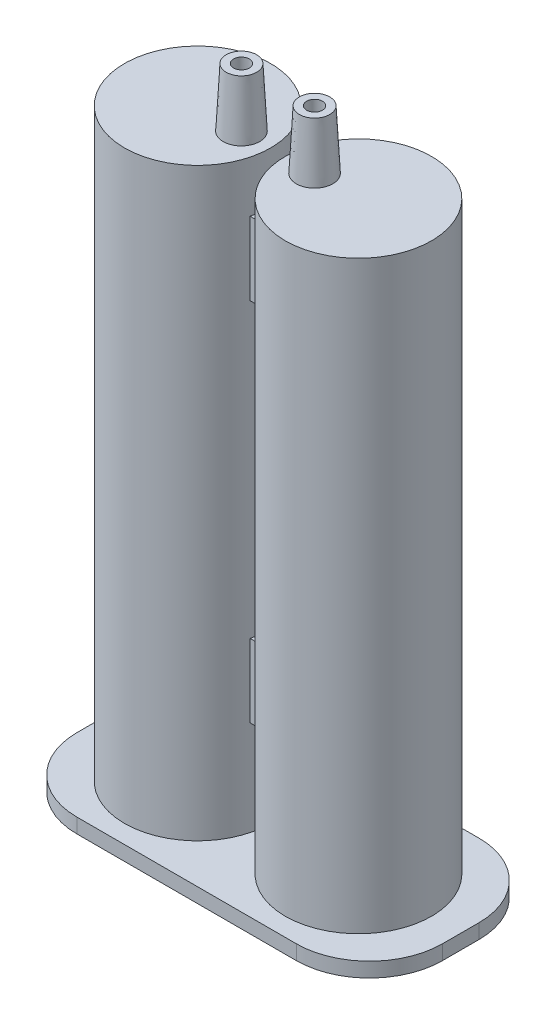
ISO-10303-21;
HEADER;
FILE_DESCRIPTION(('STEP AP214'),'2;1');
FILE_NAME('part.step','',(''),(''),'','','');
FILE_SCHEMA(('AUTOMOTIVE_DESIGN { 1 0 10303 214 1 1 1 1 }'));
ENDSEC;
DATA;
#1=APPLICATION_CONTEXT('core data for automotive mechanical design processes');
#2=APPLICATION_PROTOCOL_DEFINITION('international standard','automotive_design',2000,#1);
#3=PRODUCT_CONTEXT('',#1,'mechanical');
#4=PRODUCT('Part','Part','',(#3));
#5=PRODUCT_RELATED_PRODUCT_CATEGORY('part','',(#4));
#6=PRODUCT_DEFINITION_FORMATION('','',#4);
#7=PRODUCT_DEFINITION_CONTEXT('part definition',#1,'design');
#8=PRODUCT_DEFINITION('design','',#6,#7);
#9=PRODUCT_DEFINITION_SHAPE('','',#8);
#10=(LENGTH_UNIT() NAMED_UNIT(*) SI_UNIT(.MILLI.,.METRE.));
#11=(NAMED_UNIT(*) PLANE_ANGLE_UNIT() SI_UNIT($,.RADIAN.));
#12=(NAMED_UNIT(*) SI_UNIT($,.STERADIAN.) SOLID_ANGLE_UNIT());
#13=UNCERTAINTY_MEASURE_WITH_UNIT(LENGTH_MEASURE(1.E-05),#10,'distance_accuracy_value','');
#14=(GEOMETRIC_REPRESENTATION_CONTEXT(3) GLOBAL_UNCERTAINTY_ASSIGNED_CONTEXT((#13)) GLOBAL_UNIT_ASSIGNED_CONTEXT((#10,
#11,#12)) REPRESENTATION_CONTEXT('',''));
#15=CARTESIAN_POINT('',(0.,0.,0.));
#16=DIRECTION('',(0.,0.,1.));
#17=DIRECTION('',(1.,0.,0.));
#18=AXIS2_PLACEMENT_3D('',#15,#16,#17);
#19=CARTESIAN_POINT('',(-11.,82.,0.));
#20=DIRECTION('',(0.,-1.,0.));
#21=DIRECTION('',(0.,0.,-1.));
#22=AXIS2_PLACEMENT_3D('',#19,#20,#21);
#23=CYLINDRICAL_SURFACE('',#22,10.);
#24=CARTESIAN_POINT('',(-11.,25.,0.));
#25=DIRECTION('',(0.,1.,0.));
#26=DIRECTION('',(0.,0.,1.));
#27=AXIS2_PLACEMENT_3D('',#24,#25,#26);
#28=CIRCLE('',#27,10.);
#29=CARTESIAN_POINT('',(-1.31754163448146,25.,-2.5));
#30=VERTEX_POINT('',#29);
#31=CARTESIAN_POINT('',(-1.31754163448146,25.,2.5));
#32=VERTEX_POINT('',#31);
#33=EDGE_CURVE('E215',#30,#32,#28,.F.);
#34=ORIENTED_EDGE('',*,*,#33,.F.);
#35=DIRECTION('',(0.,-1.,0.));
#36=VECTOR('',#35,1.);
#37=CARTESIAN_POINT('',(-1.31754163448146,25.,-2.5));
#38=LINE('',#37,#36);
#39=CARTESIAN_POINT('',(-1.31754163448146,15.,-2.5));
#40=VERTEX_POINT('',#39);
#41=EDGE_CURVE('E238',#30,#40,#38,.T.);
#42=ORIENTED_EDGE('',*,*,#41,.T.);
#43=CARTESIAN_POINT('',(-11.,15.,0.));
#44=DIRECTION('',(0.,1.,0.));
#45=DIRECTION('',(0.,0.,1.));
#46=AXIS2_PLACEMENT_3D('',#43,#44,#45);
#47=CIRCLE('',#46,10.);
#48=CARTESIAN_POINT('',(-1.31754163448146,15.,2.5));
#49=VERTEX_POINT('',#48);
#50=EDGE_CURVE('E229',#40,#49,#47,.F.);
#51=ORIENTED_EDGE('',*,*,#50,.T.);
#52=DIRECTION('',(0.,-1.,0.));
#53=VECTOR('',#52,1.);
#54=CARTESIAN_POINT('',(-1.31754163448146,25.,2.5));
#55=LINE('',#54,#53);
#56=EDGE_CURVE('E237',#32,#49,#55,.T.);
#57=ORIENTED_EDGE('',*,*,#56,.F.);
#58=EDGE_LOOP('',(#34,#42,#51,#57));
#59=FACE_BOUND('',#58,.T.);
#60=CARTESIAN_POINT('',(-11.,82.,0.));
#61=DIRECTION('',(0.,1.,0.));
#62=DIRECTION('',(0.,0.,1.));
#63=AXIS2_PLACEMENT_3D('',#60,#61,#62);
#64=CIRCLE('',#63,10.);
#65=CARTESIAN_POINT('',(-11.,82.,10.));
#66=VERTEX_POINT('',#65);
#67=EDGE_CURVE('E295',#66,#66,#64,.T.);
#68=ORIENTED_EDGE('',*,*,#67,.F.);
#69=EDGE_LOOP('',(#68));
#70=FACE_BOUND('',#69,.T.);
#71=CARTESIAN_POINT('',(-11.,2.,0.));
#72=DIRECTION('',(0.,1.,0.));
#73=DIRECTION('',(0.,0.,1.));
#74=AXIS2_PLACEMENT_3D('',#71,#72,#73);
#75=CIRCLE('',#74,10.);
#76=CARTESIAN_POINT('',(-11.,2.,10.));
#77=VERTEX_POINT('',#76);
#78=EDGE_CURVE('E284',#77,#77,#75,.T.);
#79=ORIENTED_EDGE('',*,*,#78,.T.);
#80=EDGE_LOOP('',(#79));
#81=FACE_BOUND('',#80,.T.);
#82=CARTESIAN_POINT('',(-11.,75.,0.));
#83=DIRECTION('',(0.,1.,0.));
#84=DIRECTION('',(0.,0.,1.));
#85=AXIS2_PLACEMENT_3D('',#82,#83,#84);
#86=CIRCLE('',#85,10.);
#87=CARTESIAN_POINT('',(-1.31754163448146,75.,-2.5));
#88=VERTEX_POINT('',#87);
#89=CARTESIAN_POINT('',(-1.31754163448146,75.,2.5));
#90=VERTEX_POINT('',#89);
#91=EDGE_CURVE('E75',#88,#90,#86,.F.);
#92=ORIENTED_EDGE('',*,*,#91,.F.);
#93=DIRECTION('',(0.,-1.,0.));
#94=VECTOR('',#93,1.);
#95=CARTESIAN_POINT('',(-1.31754163448146,75.,-2.5));
#96=LINE('',#95,#94);
#97=CARTESIAN_POINT('',(-1.31754163448146,65.,-2.5));
#98=VERTEX_POINT('',#97);
#99=EDGE_CURVE('E195',#88,#98,#96,.T.);
#100=ORIENTED_EDGE('',*,*,#99,.T.);
#101=CARTESIAN_POINT('',(-11.,65.,0.));
#102=DIRECTION('',(0.,1.,0.));
#103=DIRECTION('',(0.,0.,1.));
#104=AXIS2_PLACEMENT_3D('',#101,#102,#103);
#105=CIRCLE('',#104,10.);
#106=CARTESIAN_POINT('',(-1.31754163448146,65.,2.5));
#107=VERTEX_POINT('',#106);
#108=EDGE_CURVE('E181',#98,#107,#105,.F.);
#109=ORIENTED_EDGE('',*,*,#108,.T.);
#110=DIRECTION('',(0.,-1.,0.));
#111=VECTOR('',#110,1.);
#112=CARTESIAN_POINT('',(-1.31754163448146,75.,2.5));
#113=LINE('',#112,#111);
#114=EDGE_CURVE('E67',#90,#107,#113,.T.);
#115=ORIENTED_EDGE('',*,*,#114,.F.);
#116=EDGE_LOOP('',(#92,#100,#109,#115));
#117=FACE_BOUND('',#116,.T.);
#118=ADVANCED_FACE('F47',(#59,#70,#81,#117),#23,.T.);
#119=CARTESIAN_POINT('',(15.,2.,-2.5));
#120=DIRECTION('',(0.,-1.,0.));
#121=DIRECTION('',(0.,0.,-1.));
#122=AXIS2_PLACEMENT_3D('',#119,#120,#121);
#123=CYLINDRICAL_SURFACE('',#122,10.);
#124=CARTESIAN_POINT('',(15.,0.,-2.5));
#125=DIRECTION('',(0.,1.,0.));
#126=DIRECTION('',(0.,0.,-1.));
#127=AXIS2_PLACEMENT_3D('',#124,#125,#126);
#128=CIRCLE('',#127,10.);
#129=CARTESIAN_POINT('',(25.,0.,-2.49999999999993));
#130=VERTEX_POINT('',#129);
#131=CARTESIAN_POINT('',(14.9999999999999,0.,-12.5));
#132=VERTEX_POINT('',#131);
#133=EDGE_CURVE('E296',#130,#132,#128,.T.);
#134=ORIENTED_EDGE('',*,*,#133,.T.);
#135=DIRECTION('',(0.,-1.,0.));
#136=VECTOR('',#135,1.);
#137=CARTESIAN_POINT('',(14.9999999999999,2.,-12.5));
#138=LINE('',#137,#136);
#139=CARTESIAN_POINT('',(14.9999999999999,2.,-12.5));
#140=VERTEX_POINT('',#139);
#141=EDGE_CURVE('E52',#140,#132,#138,.T.);
#142=ORIENTED_EDGE('',*,*,#141,.F.);
#143=CARTESIAN_POINT('',(15.,2.,-2.5));
#144=DIRECTION('',(0.,1.,0.));
#145=DIRECTION('',(0.,0.,-1.));
#146=AXIS2_PLACEMENT_3D('',#143,#144,#145);
#147=CIRCLE('',#146,10.);
#148=CARTESIAN_POINT('',(25.,2.,-2.49999999999993));
#149=VERTEX_POINT('',#148);
#150=EDGE_CURVE('E307',#149,#140,#147,.T.);
#151=ORIENTED_EDGE('',*,*,#150,.F.);
#152=DIRECTION('',(0.,-1.,0.));
#153=VECTOR('',#152,1.);
#154=CARTESIAN_POINT('',(25.,2.,-2.49999999999993));
#155=LINE('',#154,#153);
#156=EDGE_CURVE('E334',#149,#130,#155,.T.);
#157=ORIENTED_EDGE('',*,*,#156,.T.);
#158=EDGE_LOOP('',(#134,#142,#151,#157));
#159=FACE_BOUND('',#158,.T.);
#160=ADVANCED_FACE('F51',(#159),#123,.T.);
#161=CARTESIAN_POINT('',(-14.9999999999999,2.,-12.5));
#162=DIRECTION('',(0.,0.,1.));
#163=DIRECTION('',(1.,0.,0.));
#164=AXIS2_PLACEMENT_3D('',#161,#162,#163);
#165=PLANE('',#164);
#166=DIRECTION('',(-1.,0.,0.));
#167=VECTOR('',#166,1.);
#168=CARTESIAN_POINT('',(-14.9999999999999,0.,-12.5));
#169=LINE('',#168,#167);
#170=CARTESIAN_POINT('',(-14.9999999999999,0.,-12.5));
#171=VERTEX_POINT('',#170);
#172=EDGE_CURVE('E337',#132,#171,#169,.T.);
#173=ORIENTED_EDGE('',*,*,#172,.T.);
#174=DIRECTION('',(0.,-1.,0.));
#175=VECTOR('',#174,1.);
#176=CARTESIAN_POINT('',(-14.9999999999999,2.,-12.5));
#177=LINE('',#176,#175);
#178=CARTESIAN_POINT('',(-14.9999999999999,2.,-12.5));
#179=VERTEX_POINT('',#178);
#180=EDGE_CURVE('E377',#179,#171,#177,.T.);
#181=ORIENTED_EDGE('',*,*,#180,.F.);
#182=DIRECTION('',(-1.,0.,0.));
#183=VECTOR('',#182,1.);
#184=CARTESIAN_POINT('',(-14.9999999999999,2.,-12.5));
#185=LINE('',#184,#183);
#186=EDGE_CURVE('E313',#140,#179,#185,.T.);
#187=ORIENTED_EDGE('',*,*,#186,.F.);
#188=ORIENTED_EDGE('',*,*,#141,.T.);
#189=EDGE_LOOP('',(#173,#181,#187,#188));
#190=FACE_BOUND('',#189,.T.);
#191=ADVANCED_FACE('F388',(#190),#165,.F.);
#192=CARTESIAN_POINT('',(-15.,2.,-2.5));
#193=DIRECTION('',(0.,-1.,0.));
#194=DIRECTION('',(0.,0.,-1.));
#195=AXIS2_PLACEMENT_3D('',#192,#193,#194);
#196=CYLINDRICAL_SURFACE('',#195,10.);
#197=CARTESIAN_POINT('',(-15.,0.,-2.5));
#198=DIRECTION('',(0.,1.,0.));
#199=DIRECTION('',(0.,0.,-1.));
#200=AXIS2_PLACEMENT_3D('',#197,#198,#199);
#201=CIRCLE('',#200,10.);
#202=CARTESIAN_POINT('',(-25.,0.,-2.49999999999993));
#203=VERTEX_POINT('',#202);
#204=EDGE_CURVE('E340',#171,#203,#201,.T.);
#205=ORIENTED_EDGE('',*,*,#204,.T.);
#206=DIRECTION('',(0.,-1.,0.));
#207=VECTOR('',#206,1.);
#208=CARTESIAN_POINT('',(-25.,2.,-2.49999999999993));
#209=LINE('',#208,#207);
#210=CARTESIAN_POINT('',(-25.,2.,-2.49999999999993));
#211=VERTEX_POINT('',#210);
#212=EDGE_CURVE('E376',#211,#203,#209,.T.);
#213=ORIENTED_EDGE('',*,*,#212,.F.);
#214=CARTESIAN_POINT('',(-15.,2.,-2.5));
#215=DIRECTION('',(0.,1.,0.));
#216=DIRECTION('',(0.,0.,-1.));
#217=AXIS2_PLACEMENT_3D('',#214,#215,#216);
#218=CIRCLE('',#217,10.);
#219=EDGE_CURVE('E312',#179,#211,#218,.T.);
#220=ORIENTED_EDGE('',*,*,#219,.F.);
#221=ORIENTED_EDGE('',*,*,#180,.T.);
#222=EDGE_LOOP('',(#205,#213,#220,#221));
#223=FACE_BOUND('',#222,.T.);
#224=ADVANCED_FACE('F405',(#223),#196,.T.);
#225=CARTESIAN_POINT('',(-25.,2.,2.49999999999993));
#226=DIRECTION('',(1.,0.,0.));
#227=DIRECTION('',(0.,0.,-1.));
#228=AXIS2_PLACEMENT_3D('',#225,#226,#227);
#229=PLANE('',#228);
#230=DIRECTION('',(0.,0.,1.));
#231=VECTOR('',#230,1.);
#232=CARTESIAN_POINT('',(-25.,0.,2.49999999999993));
#233=LINE('',#232,#231);
#234=CARTESIAN_POINT('',(-25.,0.,2.49999999999993));
#235=VERTEX_POINT('',#234);
#236=EDGE_CURVE('E344',#203,#235,#233,.T.);
#237=ORIENTED_EDGE('',*,*,#236,.T.);
#238=DIRECTION('',(0.,-1.,0.));
#239=VECTOR('',#238,1.);
#240=CARTESIAN_POINT('',(-25.,2.,2.49999999999993));
#241=LINE('',#240,#239);
#242=CARTESIAN_POINT('',(-25.,2.,2.49999999999993));
#243=VERTEX_POINT('',#242);
#244=EDGE_CURVE('E375',#243,#235,#241,.T.);
#245=ORIENTED_EDGE('',*,*,#244,.F.);
#246=DIRECTION('',(0.,0.,1.));
#247=VECTOR('',#246,1.);
#248=CARTESIAN_POINT('',(-25.,2.,2.49999999999993));
#249=LINE('',#248,#247);
#250=EDGE_CURVE('E318',#211,#243,#249,.T.);
#251=ORIENTED_EDGE('',*,*,#250,.F.);
#252=ORIENTED_EDGE('',*,*,#212,.T.);
#253=EDGE_LOOP('',(#237,#245,#251,#252));
#254=FACE_BOUND('',#253,.T.);
#255=ADVANCED_FACE('F403',(#254),#229,.F.);
#256=CARTESIAN_POINT('',(-15.,2.,2.5));
#257=DIRECTION('',(0.,-1.,0.));
#258=DIRECTION('',(0.,0.,-1.));
#259=AXIS2_PLACEMENT_3D('',#256,#257,#258);
#260=CYLINDRICAL_SURFACE('',#259,10.);
#261=CARTESIAN_POINT('',(-15.,0.,2.5));
#262=DIRECTION('',(0.,1.,0.));
#263=DIRECTION('',(0.,0.,-1.));
#264=AXIS2_PLACEMENT_3D('',#261,#262,#263);
#265=CIRCLE('',#264,10.);
#266=CARTESIAN_POINT('',(-14.9999999999999,0.,12.5));
#267=VERTEX_POINT('',#266);
#268=EDGE_CURVE('E347',#235,#267,#265,.T.);
#269=ORIENTED_EDGE('',*,*,#268,.T.);
#270=DIRECTION('',(0.,-1.,0.));
#271=VECTOR('',#270,1.);
#272=CARTESIAN_POINT('',(-14.9999999999999,2.,12.5));
#273=LINE('',#272,#271);
#274=CARTESIAN_POINT('',(-14.9999999999999,2.,12.5));
#275=VERTEX_POINT('',#274);
#276=EDGE_CURVE('E366',#275,#267,#273,.T.);
#277=ORIENTED_EDGE('',*,*,#276,.F.);
#278=CARTESIAN_POINT('',(-15.,2.,2.5));
#279=DIRECTION('',(0.,1.,0.));
#280=DIRECTION('',(0.,0.,-1.));
#281=AXIS2_PLACEMENT_3D('',#278,#279,#280);
#282=CIRCLE('',#281,10.);
#283=EDGE_CURVE('E321',#243,#275,#282,.T.);
#284=ORIENTED_EDGE('',*,*,#283,.F.);
#285=ORIENTED_EDGE('',*,*,#244,.T.);
#286=EDGE_LOOP('',(#269,#277,#284,#285));
#287=FACE_BOUND('',#286,.T.);
#288=ADVANCED_FACE('F424',(#287),#260,.T.);
#289=CARTESIAN_POINT('',(-14.9999999999999,2.,12.5));
#290=DIRECTION('',(0.,0.,-1.));
#291=DIRECTION('',(-1.,0.,0.));
#292=AXIS2_PLACEMENT_3D('',#289,#290,#291);
#293=PLANE('',#292);
#294=DIRECTION('',(1.,0.,0.));
#295=VECTOR('',#294,1.);
#296=CARTESIAN_POINT('',(-14.9999999999999,0.,12.5));
#297=LINE('',#296,#295);
#298=CARTESIAN_POINT('',(14.9999999999999,0.,12.5));
#299=VERTEX_POINT('',#298);
#300=EDGE_CURVE('E349',#267,#299,#297,.T.);
#301=ORIENTED_EDGE('',*,*,#300,.T.);
#302=DIRECTION('',(0.,-1.,0.));
#303=VECTOR('',#302,1.);
#304=CARTESIAN_POINT('',(14.9999999999999,2.,12.5));
#305=LINE('',#304,#303);
#306=CARTESIAN_POINT('',(14.9999999999999,2.,12.5));
#307=VERTEX_POINT('',#306);
#308=EDGE_CURVE('E365',#307,#299,#305,.T.);
#309=ORIENTED_EDGE('',*,*,#308,.F.);
#310=DIRECTION('',(1.,0.,0.));
#311=VECTOR('',#310,1.);
#312=CARTESIAN_POINT('',(-14.9999999999999,2.,12.5));
#313=LINE('',#312,#311);
#314=EDGE_CURVE('E322',#275,#307,#313,.T.);
#315=ORIENTED_EDGE('',*,*,#314,.F.);
#316=ORIENTED_EDGE('',*,*,#276,.T.);
#317=EDGE_LOOP('',(#301,#309,#315,#316));
#318=FACE_BOUND('',#317,.T.);
#319=ADVANCED_FACE('F423',(#318),#293,.F.);
#320=CARTESIAN_POINT('',(15.,2.,2.5));
#321=DIRECTION('',(0.,-1.,0.));
#322=DIRECTION('',(0.,0.,-1.));
#323=AXIS2_PLACEMENT_3D('',#320,#321,#322);
#324=CYLINDRICAL_SURFACE('',#323,10.);
#325=CARTESIAN_POINT('',(15.,0.,2.5));
#326=DIRECTION('',(0.,1.,0.));
#327=DIRECTION('',(0.,0.,1.));
#328=AXIS2_PLACEMENT_3D('',#325,#326,#327);
#329=CIRCLE('',#328,10.);
#330=CARTESIAN_POINT('',(25.,0.,2.49999999999993));
#331=VERTEX_POINT('',#330);
#332=EDGE_CURVE('E352',#299,#331,#329,.T.);
#333=ORIENTED_EDGE('',*,*,#332,.T.);
#334=DIRECTION('',(0.,-1.,0.));
#335=VECTOR('',#334,1.);
#336=CARTESIAN_POINT('',(25.,2.,2.49999999999993));
#337=LINE('',#336,#335);
#338=CARTESIAN_POINT('',(25.,2.,2.49999999999993));
#339=VERTEX_POINT('',#338);
#340=EDGE_CURVE('E360',#339,#331,#337,.T.);
#341=ORIENTED_EDGE('',*,*,#340,.F.);
#342=CARTESIAN_POINT('',(15.,2.,2.5));
#343=DIRECTION('',(0.,1.,0.));
#344=DIRECTION('',(0.,0.,1.));
#345=AXIS2_PLACEMENT_3D('',#342,#343,#344);
#346=CIRCLE('',#345,10.);
#347=EDGE_CURVE('E330',#307,#339,#346,.T.);
#348=ORIENTED_EDGE('',*,*,#347,.F.);
#349=ORIENTED_EDGE('',*,*,#308,.T.);
#350=EDGE_LOOP('',(#333,#341,#348,#349));
#351=FACE_BOUND('',#350,.T.);
#352=ADVANCED_FACE('F417',(#351),#324,.T.);
#353=CARTESIAN_POINT('',(25.,2.,2.49999999999993));
#354=DIRECTION('',(-1.,0.,0.));
#355=DIRECTION('',(0.,0.,1.));
#356=AXIS2_PLACEMENT_3D('',#353,#354,#355);
#357=PLANE('',#356);
#358=DIRECTION('',(0.,0.,-1.));
#359=VECTOR('',#358,1.);
#360=CARTESIAN_POINT('',(25.,0.,2.49999999999993));
#361=LINE('',#360,#359);
#362=EDGE_CURVE('E315',#331,#130,#361,.T.);
#363=ORIENTED_EDGE('',*,*,#362,.T.);
#364=ORIENTED_EDGE('',*,*,#156,.F.);
#365=DIRECTION('',(0.,0.,-1.));
#366=VECTOR('',#365,1.);
#367=CARTESIAN_POINT('',(25.,2.,2.49999999999993));
#368=LINE('',#367,#366);
#369=EDGE_CURVE('E329',#339,#149,#368,.T.);
#370=ORIENTED_EDGE('',*,*,#369,.F.);
#371=ORIENTED_EDGE('',*,*,#340,.T.);
#372=EDGE_LOOP('',(#363,#364,#370,#371));
#373=FACE_BOUND('',#372,.T.);
#374=ADVANCED_FACE('F415',(#373),#357,.F.);
#375=CARTESIAN_POINT('',(15.,2.,-2.5));
#376=DIRECTION('',(0.,-1.,0.));
#377=DIRECTION('',(0.,0.,-1.));
#378=AXIS2_PLACEMENT_3D('',#375,#376,#377);
#379=PLANE('',#378);
#380=ORIENTED_EDGE('',*,*,#78,.F.);
#381=EDGE_LOOP('',(#380));
#382=FACE_BOUND('',#381,.T.);
#383=CARTESIAN_POINT('',(11.,2.,0.));
#384=DIRECTION('',(0.,1.,0.));
#385=DIRECTION('',(0.,0.,1.));
#386=AXIS2_PLACEMENT_3D('',#383,#384,#385);
#387=CIRCLE('',#386,10.);
#388=CARTESIAN_POINT('',(11.,2.,10.));
#389=VERTEX_POINT('',#388);
#390=EDGE_CURVE('E300',#389,#389,#387,.T.);
#391=ORIENTED_EDGE('',*,*,#390,.F.);
#392=EDGE_LOOP('',(#391));
#393=FACE_BOUND('',#392,.T.);
#394=ORIENTED_EDGE('',*,*,#150,.T.);
#395=ORIENTED_EDGE('',*,*,#186,.T.);
#396=ORIENTED_EDGE('',*,*,#219,.T.);
#397=ORIENTED_EDGE('',*,*,#250,.T.);
#398=ORIENTED_EDGE('',*,*,#283,.T.);
#399=ORIENTED_EDGE('',*,*,#314,.T.);
#400=ORIENTED_EDGE('',*,*,#347,.T.);
#401=ORIENTED_EDGE('',*,*,#369,.T.);
#402=EDGE_LOOP('',(#394,#395,#396,#397,#398,#399,#400,#401));
#403=FACE_BOUND('',#402,.T.);
#404=ADVANCED_FACE('F408',(#382,#393,#403),#379,.F.);
#405=CARTESIAN_POINT('',(15.,0.,-2.5));
#406=DIRECTION('',(0.,-1.,0.));
#407=DIRECTION('',(0.,0.,-1.));
#408=AXIS2_PLACEMENT_3D('',#405,#406,#407);
#409=PLANE('',#408);
#410=CARTESIAN_POINT('',(-11.,0.,0.));
#411=DIRECTION('',(0.,1.,0.));
#412=DIRECTION('',(0.,0.,1.));
#413=AXIS2_PLACEMENT_3D('',#410,#411,#412);
#414=CIRCLE('',#413,9.);
#415=CARTESIAN_POINT('',(-11.,0.,9.));
#416=VERTEX_POINT('',#415);
#417=EDGE_CURVE('E249',#416,#416,#414,.T.);
#418=ORIENTED_EDGE('',*,*,#417,.T.);
#419=EDGE_LOOP('',(#418));
#420=FACE_BOUND('',#419,.T.);
#421=CARTESIAN_POINT('',(11.,0.,0.));
#422=DIRECTION('',(0.,1.,0.));
#423=DIRECTION('',(0.,0.,1.));
#424=AXIS2_PLACEMENT_3D('',#421,#422,#423);
#425=CIRCLE('',#424,9.);
#426=CARTESIAN_POINT('',(11.,0.,9.));
#427=VERTEX_POINT('',#426);
#428=EDGE_CURVE('E247',#427,#427,#425,.T.);
#429=ORIENTED_EDGE('',*,*,#428,.T.);
#430=EDGE_LOOP('',(#429));
#431=FACE_BOUND('',#430,.T.);
#432=ORIENTED_EDGE('',*,*,#133,.F.);
#433=ORIENTED_EDGE('',*,*,#362,.F.);
#434=ORIENTED_EDGE('',*,*,#332,.F.);
#435=ORIENTED_EDGE('',*,*,#300,.F.);
#436=ORIENTED_EDGE('',*,*,#268,.F.);
#437=ORIENTED_EDGE('',*,*,#236,.F.);
#438=ORIENTED_EDGE('',*,*,#204,.F.);
#439=ORIENTED_EDGE('',*,*,#172,.F.);
#440=EDGE_LOOP('',(#432,#433,#434,#435,#436,#437,#438,#439));
#441=FACE_BOUND('',#440,.T.);
#442=ADVANCED_FACE('F397',(#420,#431,#441),#409,.T.);
#443=CARTESIAN_POINT('',(11.,82.,0.));
#444=DIRECTION('',(0.,-1.,0.));
#445=DIRECTION('',(0.,0.,-1.));
#446=AXIS2_PLACEMENT_3D('',#443,#444,#445);
#447=CYLINDRICAL_SURFACE('',#446,10.);
#448=DIRECTION('',(0.,-1.,0.));
#449=VECTOR('',#448,1.);
#450=CARTESIAN_POINT('',(1.31754163448146,75.,-2.5));
#451=LINE('',#450,#449);
#452=CARTESIAN_POINT('',(1.31754163448146,75.,-2.5));
#453=VERTEX_POINT('',#452);
#454=CARTESIAN_POINT('',(1.31754163448146,65.,-2.5));
#455=VERTEX_POINT('',#454);
#456=EDGE_CURVE('E175',#453,#455,#451,.T.);
#457=ORIENTED_EDGE('',*,*,#456,.F.);
#458=CARTESIAN_POINT('',(11.,75.,0.));
#459=DIRECTION('',(0.,1.,0.));
#460=DIRECTION('',(0.,0.,1.));
#461=AXIS2_PLACEMENT_3D('',#458,#459,#460);
#462=CIRCLE('',#461,10.);
#463=CARTESIAN_POINT('',(1.31754163448146,75.,2.5));
#464=VERTEX_POINT('',#463);
#465=EDGE_CURVE('E171',#453,#464,#462,.T.);
#466=ORIENTED_EDGE('',*,*,#465,.T.);
#467=DIRECTION('',(0.,-1.,0.));
#468=VECTOR('',#467,1.);
#469=CARTESIAN_POINT('',(1.31754163448146,75.,2.5));
#470=LINE('',#469,#468);
#471=CARTESIAN_POINT('',(1.31754163448146,65.,2.5));
#472=VERTEX_POINT('',#471);
#473=EDGE_CURVE('E162',#464,#472,#470,.T.);
#474=ORIENTED_EDGE('',*,*,#473,.T.);
#475=CARTESIAN_POINT('',(11.,65.,0.));
#476=DIRECTION('',(0.,1.,0.));
#477=DIRECTION('',(0.,0.,1.));
#478=AXIS2_PLACEMENT_3D('',#475,#476,#477);
#479=CIRCLE('',#478,10.);
#480=EDGE_CURVE('E169',#455,#472,#479,.T.);
#481=ORIENTED_EDGE('',*,*,#480,.F.);
#482=EDGE_LOOP('',(#457,#466,#474,#481));
#483=FACE_BOUND('',#482,.T.);
#484=DIRECTION('',(0.,-1.,0.));
#485=VECTOR('',#484,1.);
#486=CARTESIAN_POINT('',(1.31754163448146,25.,-2.5));
#487=LINE('',#486,#485);
#488=CARTESIAN_POINT('',(1.31754163448146,25.,-2.5));
#489=VERTEX_POINT('',#488);
#490=CARTESIAN_POINT('',(1.31754163448146,15.,-2.5));
#491=VERTEX_POINT('',#490);
#492=EDGE_CURVE('E244',#489,#491,#487,.T.);
#493=ORIENTED_EDGE('',*,*,#492,.F.);
#494=CARTESIAN_POINT('',(11.,25.,0.));
#495=DIRECTION('',(0.,1.,0.));
#496=DIRECTION('',(0.,0.,1.));
#497=AXIS2_PLACEMENT_3D('',#494,#495,#496);
#498=CIRCLE('',#497,10.);
#499=CARTESIAN_POINT('',(1.31754163448146,25.,2.5));
#500=VERTEX_POINT('',#499);
#501=EDGE_CURVE('E204',#489,#500,#498,.T.);
#502=ORIENTED_EDGE('',*,*,#501,.T.);
#503=DIRECTION('',(0.,-1.,0.));
#504=VECTOR('',#503,1.);
#505=CARTESIAN_POINT('',(1.31754163448146,25.,2.5));
#506=LINE('',#505,#504);
#507=CARTESIAN_POINT('',(1.31754163448146,15.,2.5));
#508=VERTEX_POINT('',#507);
#509=EDGE_CURVE('E219',#500,#508,#506,.T.);
#510=ORIENTED_EDGE('',*,*,#509,.T.);
#511=CARTESIAN_POINT('',(11.,15.,0.));
#512=DIRECTION('',(0.,1.,0.));
#513=DIRECTION('',(0.,0.,1.));
#514=AXIS2_PLACEMENT_3D('',#511,#512,#513);
#515=CIRCLE('',#514,10.);
#516=EDGE_CURVE('E201',#491,#508,#515,.T.);
#517=ORIENTED_EDGE('',*,*,#516,.F.);
#518=EDGE_LOOP('',(#493,#502,#510,#517));
#519=FACE_BOUND('',#518,.T.);
#520=CARTESIAN_POINT('',(11.,82.,0.));
#521=DIRECTION('',(0.,1.,0.));
#522=DIRECTION('',(0.,0.,1.));
#523=AXIS2_PLACEMENT_3D('',#520,#521,#522);
#524=CIRCLE('',#523,10.);
#525=CARTESIAN_POINT('',(11.,82.,10.));
#526=VERTEX_POINT('',#525);
#527=EDGE_CURVE('E289',#526,#526,#524,.T.);
#528=ORIENTED_EDGE('',*,*,#527,.F.);
#529=EDGE_LOOP('',(#528));
#530=FACE_BOUND('',#529,.T.);
#531=ORIENTED_EDGE('',*,*,#390,.T.);
#532=EDGE_LOOP('',(#531));
#533=FACE_BOUND('',#532,.T.);
#534=ADVANCED_FACE('F164',(#483,#519,#530,#533),#447,.T.);
#535=CARTESIAN_POINT('',(0.,82.,0.));
#536=DIRECTION('',(0.,1.,0.));
#537=DIRECTION('',(0.,0.,1.));
#538=AXIS2_PLACEMENT_3D('',#535,#536,#537);
#539=PLANE('',#538);
#540=CARTESIAN_POINT('',(5.,82.,0.));
#541=DIRECTION('',(0.,1.,0.));
#542=DIRECTION('',(0.,0.,1.));
#543=AXIS2_PLACEMENT_3D('',#540,#541,#542);
#544=CIRCLE('',#543,2.5);
#545=CARTESIAN_POINT('',(5.,82.,2.5));
#546=VERTEX_POINT('',#545);
#547=EDGE_CURVE('E11',#546,#546,#544,.T.);
#548=ORIENTED_EDGE('',*,*,#547,.F.);
#549=EDGE_LOOP('',(#548));
#550=FACE_BOUND('',#549,.T.);
#551=ORIENTED_EDGE('',*,*,#527,.T.);
#552=EDGE_LOOP('',(#551));
#553=FACE_BOUND('',#552,.T.);
#554=ADVANCED_FACE('F446',(#550,#553),#539,.T.);
#555=CARTESIAN_POINT('',(0.,82.,0.));
#556=DIRECTION('',(0.,1.,0.));
#557=DIRECTION('',(0.,0.,1.));
#558=AXIS2_PLACEMENT_3D('',#555,#556,#557);
#559=PLANE('',#558);
#560=CARTESIAN_POINT('',(-5.,82.,0.));
#561=DIRECTION('',(0.,1.,0.));
#562=DIRECTION('',(0.,0.,1.));
#563=AXIS2_PLACEMENT_3D('',#560,#561,#562);
#564=CIRCLE('',#563,2.5);
#565=CARTESIAN_POINT('',(-5.,82.,2.5));
#566=VERTEX_POINT('',#565);
#567=EDGE_CURVE('E56',#566,#566,#564,.T.);
#568=ORIENTED_EDGE('',*,*,#567,.F.);
#569=EDGE_LOOP('',(#568));
#570=FACE_BOUND('',#569,.T.);
#571=ORIENTED_EDGE('',*,*,#67,.T.);
#572=EDGE_LOOP('',(#571));
#573=FACE_BOUND('',#572,.T.);
#574=ADVANCED_FACE('F441',(#570,#573),#559,.T.);
#575=CARTESIAN_POINT('',(-5.,82.,0.));
#576=DIRECTION('',(0.,-1.,0.));
#577=DIRECTION('',(0.,0.,1.));
#578=AXIS2_PLACEMENT_3D('',#575,#576,#577);
#579=CONICAL_SURFACE('',#578,2.5,0.05235987755983);
#580=CARTESIAN_POINT('',(-5.,90.,0.));
#581=DIRECTION('',(0.,1.,0.));
#582=DIRECTION('',(0.,0.,1.));
#583=AXIS2_PLACEMENT_3D('',#580,#581,#582);
#584=CIRCLE('',#583,2.08073776573567);
#585=CARTESIAN_POINT('',(-5.,90.,2.08073776573567));
#586=VERTEX_POINT('',#585);
#587=EDGE_CURVE('E283',#586,#586,#584,.T.);
#588=ORIENTED_EDGE('',*,*,#587,.F.);
#589=EDGE_LOOP('',(#588));
#590=FACE_BOUND('',#589,.T.);
#591=ORIENTED_EDGE('',*,*,#567,.T.);
#592=EDGE_LOOP('',(#591));
#593=FACE_BOUND('',#592,.T.);
#594=ADVANCED_FACE('F488',(#590,#593),#579,.T.);
#595=CARTESIAN_POINT('',(-5.,90.,0.));
#596=DIRECTION('',(0.,1.,0.));
#597=DIRECTION('',(0.,0.,1.));
#598=AXIS2_PLACEMENT_3D('',#595,#596,#597);
#599=PLANE('',#598);
#600=CARTESIAN_POINT('',(-5.,90.,0.));
#601=DIRECTION('',(0.,1.,0.));
#602=DIRECTION('',(0.,0.,1.));
#603=AXIS2_PLACEMENT_3D('',#600,#601,#602);
#604=CIRCLE('',#603,1.07936541973775);
#605=CARTESIAN_POINT('',(-5.,90.,1.07936541973775));
#606=VERTEX_POINT('',#605);
#607=EDGE_CURVE('E261',#606,#606,#604,.T.);
#608=ORIENTED_EDGE('',*,*,#607,.F.);
#609=EDGE_LOOP('',(#608));
#610=FACE_BOUND('',#609,.T.);
#611=ORIENTED_EDGE('',*,*,#587,.T.);
#612=EDGE_LOOP('',(#611));
#613=FACE_BOUND('',#612,.T.);
#614=ADVANCED_FACE('F494',(#610,#613),#599,.T.);
#615=CARTESIAN_POINT('',(5.,82.,0.));
#616=DIRECTION('',(0.,-1.,0.));
#617=DIRECTION('',(0.,0.,1.));
#618=AXIS2_PLACEMENT_3D('',#615,#616,#617);
#619=CONICAL_SURFACE('',#618,2.5,0.05235987755983);
#620=CARTESIAN_POINT('',(5.,90.,0.));
#621=DIRECTION('',(0.,1.,0.));
#622=DIRECTION('',(0.,0.,1.));
#623=AXIS2_PLACEMENT_3D('',#620,#621,#622);
#624=CIRCLE('',#623,2.08073776573567);
#625=CARTESIAN_POINT('',(5.,90.,2.08073776573567));
#626=VERTEX_POINT('',#625);
#627=EDGE_CURVE('E266',#626,#626,#624,.T.);
#628=ORIENTED_EDGE('',*,*,#627,.F.);
#629=EDGE_LOOP('',(#628));
#630=FACE_BOUND('',#629,.T.);
#631=ORIENTED_EDGE('',*,*,#547,.T.);
#632=EDGE_LOOP('',(#631));
#633=FACE_BOUND('',#632,.T.);
#634=ADVANCED_FACE('F502',(#630,#633),#619,.T.);
#635=CARTESIAN_POINT('',(5.,90.,0.));
#636=DIRECTION('',(0.,1.,0.));
#637=DIRECTION('',(0.,0.,1.));
#638=AXIS2_PLACEMENT_3D('',#635,#636,#637);
#639=PLANE('',#638);
#640=CARTESIAN_POINT('',(5.,90.,0.));
#641=DIRECTION('',(0.,1.,0.));
#642=DIRECTION('',(0.,0.,1.));
#643=AXIS2_PLACEMENT_3D('',#640,#641,#642);
#644=CIRCLE('',#643,1.07936541973775);
#645=CARTESIAN_POINT('',(5.,90.,1.07936541973775));
#646=VERTEX_POINT('',#645);
#647=EDGE_CURVE('E252',#646,#646,#644,.T.);
#648=ORIENTED_EDGE('',*,*,#647,.F.);
#649=EDGE_LOOP('',(#648));
#650=FACE_BOUND('',#649,.T.);
#651=ORIENTED_EDGE('',*,*,#627,.T.);
#652=EDGE_LOOP('',(#651));
#653=FACE_BOUND('',#652,.T.);
#654=ADVANCED_FACE('F506',(#650,#653),#639,.T.);
#655=CARTESIAN_POINT('',(5.,81.9476640437571,0.));
#656=DIRECTION('',(0.,-1.,0.));
#657=DIRECTION('',(0.,0.,1.));
#658=AXIS2_PLACEMENT_3D('',#655,#656,#657);
#659=CONICAL_SURFACE('',#658,1.50137046524543,0.05235987755983);
#660=ORIENTED_EDGE('',*,*,#647,.T.);
#661=EDGE_LOOP('',(#660));
#662=FACE_BOUND('',#661,.T.);
#663=CARTESIAN_POINT('',(5.,81.,0.));
#664=DIRECTION('',(0.,1.,0.));
#665=DIRECTION('',(0.,0.,1.));
#666=AXIS2_PLACEMENT_3D('',#663,#664,#665);
#667=CIRCLE('',#666,1.55103543328512);
#668=CARTESIAN_POINT('',(5.,81.,1.55103543328512));
#669=VERTEX_POINT('',#668);
#670=EDGE_CURVE('E265',#669,#669,#667,.T.);
#671=ORIENTED_EDGE('',*,*,#670,.F.);
#672=EDGE_LOOP('',(#671));
#673=FACE_BOUND('',#672,.T.);
#674=ADVANCED_FACE('F522',(#662,#673),#659,.F.);
#675=CARTESIAN_POINT('',(0.,81.,0.));
#676=DIRECTION('',(0.,1.,0.));
#677=DIRECTION('',(0.,0.,1.));
#678=AXIS2_PLACEMENT_3D('',#675,#676,#677);
#679=PLANE('',#678);
#680=ORIENTED_EDGE('',*,*,#670,.T.);
#681=EDGE_LOOP('',(#680));
#682=FACE_BOUND('',#681,.T.);
#683=CARTESIAN_POINT('',(11.,81.,0.));
#684=DIRECTION('',(0.,1.,0.));
#685=DIRECTION('',(0.,0.,1.));
#686=AXIS2_PLACEMENT_3D('',#683,#684,#685);
#687=CIRCLE('',#686,9.);
#688=CARTESIAN_POINT('',(11.,81.,9.));
#689=VERTEX_POINT('',#688);
#690=EDGE_CURVE('E258',#689,#689,#687,.T.);
#691=ORIENTED_EDGE('',*,*,#690,.F.);
#692=EDGE_LOOP('',(#691));
#693=FACE_BOUND('',#692,.T.);
#694=ADVANCED_FACE('F533',(#682,#693),#679,.F.);
#695=CARTESIAN_POINT('',(11.,82.,0.));
#696=DIRECTION('',(0.,-1.,0.));
#697=DIRECTION('',(0.,0.,-1.));
#698=AXIS2_PLACEMENT_3D('',#695,#696,#697);
#699=CYLINDRICAL_SURFACE('',#698,9.);
#700=ORIENTED_EDGE('',*,*,#690,.T.);
#701=EDGE_LOOP('',(#700));
#702=FACE_BOUND('',#701,.T.);
#703=ORIENTED_EDGE('',*,*,#428,.F.);
#704=EDGE_LOOP('',(#703));
#705=FACE_BOUND('',#704,.T.);
#706=ADVANCED_FACE('F545',(#702,#705),#699,.F.);
#707=CARTESIAN_POINT('',(-11.,82.,0.));
#708=DIRECTION('',(0.,-1.,0.));
#709=DIRECTION('',(0.,0.,-1.));
#710=AXIS2_PLACEMENT_3D('',#707,#708,#709);
#711=CYLINDRICAL_SURFACE('',#710,9.);
#712=CARTESIAN_POINT('',(-11.,81.,0.));
#713=DIRECTION('',(0.,1.,0.));
#714=DIRECTION('',(0.,0.,1.));
#715=AXIS2_PLACEMENT_3D('',#712,#713,#714);
#716=CIRCLE('',#715,9.);
#717=CARTESIAN_POINT('',(-11.,81.,9.));
#718=VERTEX_POINT('',#717);
#719=EDGE_CURVE('E257',#718,#718,#716,.T.);
#720=ORIENTED_EDGE('',*,*,#719,.T.);
#721=EDGE_LOOP('',(#720));
#722=FACE_BOUND('',#721,.T.);
#723=ORIENTED_EDGE('',*,*,#417,.F.);
#724=EDGE_LOOP('',(#723));
#725=FACE_BOUND('',#724,.T.);
#726=ADVANCED_FACE('F551',(#722,#725),#711,.F.);
#727=CARTESIAN_POINT('',(0.,81.,0.));
#728=DIRECTION('',(0.,1.,0.));
#729=DIRECTION('',(0.,0.,1.));
#730=AXIS2_PLACEMENT_3D('',#727,#728,#729);
#731=PLANE('',#730);
#732=CARTESIAN_POINT('',(-5.,81.,0.));
#733=DIRECTION('',(0.,1.,0.));
#734=DIRECTION('',(0.,0.,1.));
#735=AXIS2_PLACEMENT_3D('',#732,#733,#734);
#736=CIRCLE('',#735,1.55103543328512);
#737=CARTESIAN_POINT('',(-5.,81.,1.55103543328512));
#738=VERTEX_POINT('',#737);
#739=EDGE_CURVE('E270',#738,#738,#736,.T.);
#740=ORIENTED_EDGE('',*,*,#739,.T.);
#741=EDGE_LOOP('',(#740));
#742=FACE_BOUND('',#741,.T.);
#743=ORIENTED_EDGE('',*,*,#719,.F.);
#744=EDGE_LOOP('',(#743));
#745=FACE_BOUND('',#744,.T.);
#746=ADVANCED_FACE('F548',(#742,#745),#731,.F.);
#747=CARTESIAN_POINT('',(-5.,81.9476640437571,0.));
#748=DIRECTION('',(0.,-1.,0.));
#749=DIRECTION('',(0.,0.,1.));
#750=AXIS2_PLACEMENT_3D('',#747,#748,#749);
#751=CONICAL_SURFACE('',#750,1.50137046524543,0.05235987755983);
#752=ORIENTED_EDGE('',*,*,#607,.T.);
#753=EDGE_LOOP('',(#752));
#754=FACE_BOUND('',#753,.T.);
#755=ORIENTED_EDGE('',*,*,#739,.F.);
#756=EDGE_LOOP('',(#755));
#757=FACE_BOUND('',#756,.T.);
#758=ADVANCED_FACE('F554',(#754,#757),#751,.F.);
#759=CARTESIAN_POINT('',(0.,25.,-2.5));
#760=DIRECTION('',(0.,0.,-1.));
#761=DIRECTION('',(-1.,0.,0.));
#762=AXIS2_PLACEMENT_3D('',#759,#760,#761);
#763=PLANE('',#762);
#764=DIRECTION('',(1.,0.,0.));
#765=VECTOR('',#764,1.);
#766=CARTESIAN_POINT('',(0.,15.,-2.5));
#767=LINE('',#766,#765);
#768=EDGE_CURVE('E221',#40,#491,#767,.T.);
#769=ORIENTED_EDGE('',*,*,#768,.F.);
#770=ORIENTED_EDGE('',*,*,#41,.F.);
#771=DIRECTION('',(1.,0.,0.));
#772=VECTOR('',#771,1.);
#773=CARTESIAN_POINT('',(0.,25.,-2.5));
#774=LINE('',#773,#772);
#775=EDGE_CURVE('E210',#30,#489,#774,.T.);
#776=ORIENTED_EDGE('',*,*,#775,.T.);
#777=ORIENTED_EDGE('',*,*,#492,.T.);
#778=EDGE_LOOP('',(#769,#770,#776,#777));
#779=FACE_BOUND('',#778,.T.);
#780=ADVANCED_FACE('F561',(#779),#763,.T.);
#781=CARTESIAN_POINT('',(0.,25.,2.5));
#782=DIRECTION('',(0.,0.,-1.));
#783=DIRECTION('',(-1.,0.,0.));
#784=AXIS2_PLACEMENT_3D('',#781,#782,#783);
#785=PLANE('',#784);
#786=DIRECTION('',(1.,0.,0.));
#787=VECTOR('',#786,1.);
#788=CARTESIAN_POINT('',(0.,15.,2.5));
#789=LINE('',#788,#787);
#790=EDGE_CURVE('E208',#49,#508,#789,.T.);
#791=ORIENTED_EDGE('',*,*,#790,.T.);
#792=ORIENTED_EDGE('',*,*,#509,.F.);
#793=DIRECTION('',(1.,0.,0.));
#794=VECTOR('',#793,1.);
#795=CARTESIAN_POINT('',(0.,25.,2.5));
#796=LINE('',#795,#794);
#797=EDGE_CURVE('E216',#32,#500,#796,.T.);
#798=ORIENTED_EDGE('',*,*,#797,.F.);
#799=ORIENTED_EDGE('',*,*,#56,.T.);
#800=EDGE_LOOP('',(#791,#792,#798,#799));
#801=FACE_BOUND('',#800,.T.);
#802=ADVANCED_FACE('F589',(#801),#785,.F.);
#803=CARTESIAN_POINT('',(0.,25.,0.));
#804=DIRECTION('',(0.,1.,0.));
#805=DIRECTION('',(0.,0.,1.));
#806=AXIS2_PLACEMENT_3D('',#803,#804,#805);
#807=PLANE('',#806);
#808=ORIENTED_EDGE('',*,*,#501,.F.);
#809=ORIENTED_EDGE('',*,*,#775,.F.);
#810=ORIENTED_EDGE('',*,*,#33,.T.);
#811=ORIENTED_EDGE('',*,*,#797,.T.);
#812=EDGE_LOOP('',(#808,#809,#810,#811));
#813=FACE_BOUND('',#812,.T.);
#814=ADVANCED_FACE('F598',(#813),#807,.T.);
#815=CARTESIAN_POINT('',(0.,15.,0.));
#816=DIRECTION('',(0.,1.,0.));
#817=DIRECTION('',(0.,0.,1.));
#818=AXIS2_PLACEMENT_3D('',#815,#816,#817);
#819=PLANE('',#818);
#820=ORIENTED_EDGE('',*,*,#516,.T.);
#821=ORIENTED_EDGE('',*,*,#790,.F.);
#822=ORIENTED_EDGE('',*,*,#50,.F.);
#823=ORIENTED_EDGE('',*,*,#768,.T.);
#824=EDGE_LOOP('',(#820,#821,#822,#823));
#825=FACE_BOUND('',#824,.T.);
#826=ADVANCED_FACE('F610',(#825),#819,.F.);
#827=CARTESIAN_POINT('',(0.,75.,2.5));
#828=DIRECTION('',(0.,0.,-1.));
#829=DIRECTION('',(-1.,0.,0.));
#830=AXIS2_PLACEMENT_3D('',#827,#828,#829);
#831=PLANE('',#830);
#832=DIRECTION('',(1.,0.,0.));
#833=VECTOR('',#832,1.);
#834=CARTESIAN_POINT('',(0.,65.,2.5));
#835=LINE('',#834,#833);
#836=EDGE_CURVE('E179',#107,#472,#835,.T.);
#837=ORIENTED_EDGE('',*,*,#836,.T.);
#838=ORIENTED_EDGE('',*,*,#473,.F.);
#839=DIRECTION('',(1.,0.,0.));
#840=VECTOR('',#839,1.);
#841=CARTESIAN_POINT('',(0.,75.,2.5));
#842=LINE('',#841,#840);
#843=EDGE_CURVE('E668',#90,#464,#842,.T.);
#844=ORIENTED_EDGE('',*,*,#843,.F.);
#845=ORIENTED_EDGE('',*,*,#114,.T.);
#846=EDGE_LOOP('',(#837,#838,#844,#845));
#847=FACE_BOUND('',#846,.T.);
#848=ADVANCED_FACE('F178',(#847),#831,.F.);
#849=CARTESIAN_POINT('',(0.,75.,-2.5));
#850=DIRECTION('',(0.,0.,-1.));
#851=DIRECTION('',(-1.,0.,0.));
#852=AXIS2_PLACEMENT_3D('',#849,#850,#851);
#853=PLANE('',#852);
#854=DIRECTION('',(1.,0.,0.));
#855=VECTOR('',#854,1.);
#856=CARTESIAN_POINT('',(0.,65.,-2.5));
#857=LINE('',#856,#855);
#858=EDGE_CURVE('E189',#98,#455,#857,.T.);
#859=ORIENTED_EDGE('',*,*,#858,.F.);
#860=ORIENTED_EDGE('',*,*,#99,.F.);
#861=DIRECTION('',(1.,0.,0.));
#862=VECTOR('',#861,1.);
#863=CARTESIAN_POINT('',(0.,75.,-2.5));
#864=LINE('',#863,#862);
#865=EDGE_CURVE('E196',#88,#453,#864,.T.);
#866=ORIENTED_EDGE('',*,*,#865,.T.);
#867=ORIENTED_EDGE('',*,*,#456,.T.);
#868=EDGE_LOOP('',(#859,#860,#866,#867));
#869=FACE_BOUND('',#868,.T.);
#870=ADVANCED_FACE('F632',(#869),#853,.T.);
#871=CARTESIAN_POINT('',(0.,75.,0.));
#872=DIRECTION('',(0.,1.,0.));
#873=DIRECTION('',(0.,0.,1.));
#874=AXIS2_PLACEMENT_3D('',#871,#872,#873);
#875=PLANE('',#874);
#876=ORIENTED_EDGE('',*,*,#91,.T.);
#877=ORIENTED_EDGE('',*,*,#843,.T.);
#878=ORIENTED_EDGE('',*,*,#465,.F.);
#879=ORIENTED_EDGE('',*,*,#865,.F.);
#880=EDGE_LOOP('',(#876,#877,#878,#879));
#881=FACE_BOUND('',#880,.T.);
#882=ADVANCED_FACE('F643',(#881),#875,.T.);
#883=CARTESIAN_POINT('',(0.,65.,0.));
#884=DIRECTION('',(0.,1.,0.));
#885=DIRECTION('',(0.,0.,1.));
#886=AXIS2_PLACEMENT_3D('',#883,#884,#885);
#887=PLANE('',#886);
#888=ORIENTED_EDGE('',*,*,#108,.F.);
#889=ORIENTED_EDGE('',*,*,#858,.T.);
#890=ORIENTED_EDGE('',*,*,#480,.T.);
#891=ORIENTED_EDGE('',*,*,#836,.F.);
#892=EDGE_LOOP('',(#888,#889,#890,#891));
#893=FACE_BOUND('',#892,.T.);
#894=ADVANCED_FACE('F186',(#893),#887,.F.);
#895=CLOSED_SHELL('',(#118,#160,#191,#224,#255,#288,#319,#352,#374,#404,#442,#534,#554,#574,
#594,#614,#634,#654,#674,#694,#706,#726,#746,#758,#780,#802,#814,#826,#848,#870,#882,#894));
#896=MANIFOLD_SOLID_BREP('B2',#895);
#897=ADVANCED_BREP_SHAPE_REPRESENTATION('',(#18,#896),#14);
#898=SHAPE_DEFINITION_REPRESENTATION(#9,#897);
ENDSEC;
END-ISO-10303-21;
